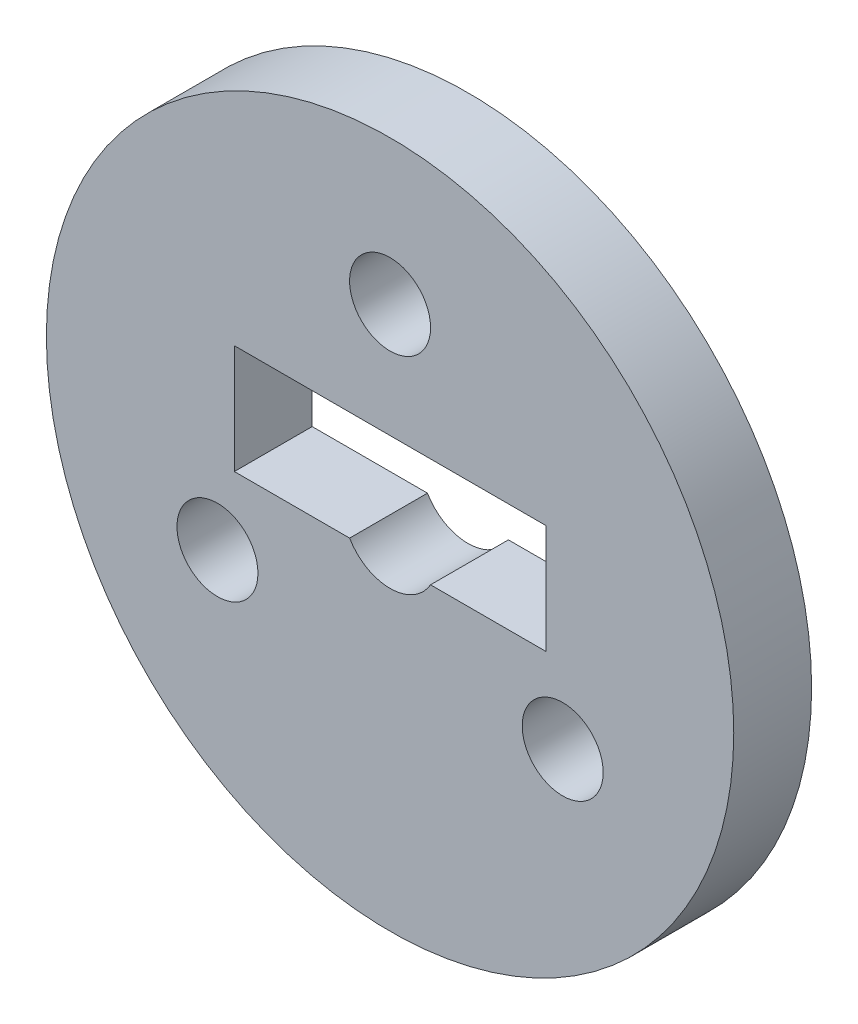
ISO-10303-21;
HEADER;
FILE_DESCRIPTION(('STEP AP214'),'2;1');
FILE_NAME('part.step','',(''),(''),'','','');
FILE_SCHEMA(('AUTOMOTIVE_DESIGN { 1 0 10303 214 1 1 1 1 }'));
ENDSEC;
DATA;
#1=APPLICATION_CONTEXT('core data for automotive mechanical design processes');
#2=APPLICATION_PROTOCOL_DEFINITION('international standard','automotive_design',2000,#1);
#3=PRODUCT_CONTEXT('',#1,'mechanical');
#4=PRODUCT('Part','Part','',(#3));
#5=PRODUCT_RELATED_PRODUCT_CATEGORY('part','',(#4));
#6=PRODUCT_DEFINITION_FORMATION('','',#4);
#7=PRODUCT_DEFINITION_CONTEXT('part definition',#1,'design');
#8=PRODUCT_DEFINITION('design','',#6,#7);
#9=PRODUCT_DEFINITION_SHAPE('','',#8);
#10=(LENGTH_UNIT() NAMED_UNIT(*) SI_UNIT(.MILLI.,.METRE.));
#11=(NAMED_UNIT(*) PLANE_ANGLE_UNIT() SI_UNIT($,.RADIAN.));
#12=(NAMED_UNIT(*) SI_UNIT($,.STERADIAN.) SOLID_ANGLE_UNIT());
#13=UNCERTAINTY_MEASURE_WITH_UNIT(LENGTH_MEASURE(1.E-05),#10,'distance_accuracy_value','');
#14=(GEOMETRIC_REPRESENTATION_CONTEXT(3) GLOBAL_UNCERTAINTY_ASSIGNED_CONTEXT((#13)) GLOBAL_UNIT_ASSIGNED_CONTEXT((#10,
#11,#12)) REPRESENTATION_CONTEXT('',''));
#15=CARTESIAN_POINT('',(0.,0.,0.));
#16=DIRECTION('',(0.,0.,1.));
#17=DIRECTION('',(1.,0.,0.));
#18=AXIS2_PLACEMENT_3D('',#15,#16,#17);
#19=CARTESIAN_POINT('',(0.,0.,5.));
#20=DIRECTION('',(0.,0.,-1.));
#21=DIRECTION('',(-1.,0.,0.));
#22=AXIS2_PLACEMENT_3D('',#19,#20,#21);
#23=CYLINDRICAL_SURFACE('',#22,3.);
#24=CARTESIAN_POINT('',(0.,0.,0.));
#25=DIRECTION('',(0.,0.,1.));
#26=DIRECTION('',(1.,0.,0.));
#27=AXIS2_PLACEMENT_3D('',#24,#25,#26);
#28=CIRCLE('',#27,3.);
#29=CARTESIAN_POINT('',(-2.59807621135332,-1.5,0.));
#30=VERTEX_POINT('',#29);
#31=CARTESIAN_POINT('',(2.59807621135332,-1.5,0.));
#32=VERTEX_POINT('',#31);
#33=EDGE_CURVE('E131',#30,#32,#28,.T.);
#34=ORIENTED_EDGE('',*,*,#33,.F.);
#35=DIRECTION('',(0.,0.,-1.));
#36=VECTOR('',#35,1.);
#37=CARTESIAN_POINT('',(-2.59807621135332,-1.5,5.));
#38=LINE('',#37,#36);
#39=CARTESIAN_POINT('',(-2.59807621135332,-1.5,5.));
#40=VERTEX_POINT('',#39);
#41=EDGE_CURVE('E11',#40,#30,#38,.T.);
#42=ORIENTED_EDGE('',*,*,#41,.F.);
#43=CARTESIAN_POINT('',(0.,0.,5.));
#44=DIRECTION('',(0.,0.,1.));
#45=DIRECTION('',(1.,0.,0.));
#46=AXIS2_PLACEMENT_3D('',#43,#44,#45);
#47=CIRCLE('',#46,3.);
#48=CARTESIAN_POINT('',(2.59807621135332,-1.5,5.));
#49=VERTEX_POINT('',#48);
#50=EDGE_CURVE('E155',#40,#49,#47,.T.);
#51=ORIENTED_EDGE('',*,*,#50,.T.);
#52=DIRECTION('',(0.,0.,-1.));
#53=VECTOR('',#52,1.);
#54=CARTESIAN_POINT('',(2.59807621135332,-1.5,5.));
#55=LINE('',#54,#53);
#56=EDGE_CURVE('E81',#49,#32,#55,.T.);
#57=ORIENTED_EDGE('',*,*,#56,.T.);
#58=EDGE_LOOP('',(#34,#42,#51,#57));
#59=FACE_BOUND('',#58,.T.);
#60=ADVANCED_FACE('F37',(#59),#23,.F.);
#61=CARTESIAN_POINT('',(0.,-1.5,5.));
#62=DIRECTION('',(0.,-1.,0.));
#63=DIRECTION('',(1.,0.,0.));
#64=AXIS2_PLACEMENT_3D('',#61,#62,#63);
#65=PLANE('',#64);
#66=DIRECTION('',(-1.,0.,0.));
#67=VECTOR('',#66,1.);
#68=CARTESIAN_POINT('',(0.,-1.5,0.));
#69=LINE('',#68,#67);
#70=CARTESIAN_POINT('',(-10.,-1.5,0.));
#71=VERTEX_POINT('',#70);
#72=EDGE_CURVE('E134',#30,#71,#69,.T.);
#73=ORIENTED_EDGE('',*,*,#72,.T.);
#74=DIRECTION('',(0.,0.,-1.));
#75=VECTOR('',#74,1.);
#76=CARTESIAN_POINT('',(-10.,-1.5,5.));
#77=LINE('',#76,#75);
#78=CARTESIAN_POINT('',(-10.,-1.5,5.));
#79=VERTEX_POINT('',#78);
#80=EDGE_CURVE('E45',#79,#71,#77,.T.);
#81=ORIENTED_EDGE('',*,*,#80,.F.);
#82=DIRECTION('',(-1.,0.,0.));
#83=VECTOR('',#82,1.);
#84=CARTESIAN_POINT('',(0.,-1.5,5.));
#85=LINE('',#84,#83);
#86=EDGE_CURVE('E115',#40,#79,#85,.T.);
#87=ORIENTED_EDGE('',*,*,#86,.F.);
#88=ORIENTED_EDGE('',*,*,#41,.T.);
#89=EDGE_LOOP('',(#73,#81,#87,#88));
#90=FACE_BOUND('',#89,.T.);
#91=ADVANCED_FACE('F164',(#90),#65,.F.);
#92=CARTESIAN_POINT('',(-10.,0.,5.));
#93=DIRECTION('',(1.,0.,0.));
#94=DIRECTION('',(0.,0.,-1.));
#95=AXIS2_PLACEMENT_3D('',#92,#93,#94);
#96=PLANE('',#95);
#97=DIRECTION('',(0.,-1.,0.));
#98=VECTOR('',#97,1.);
#99=CARTESIAN_POINT('',(-10.,0.,0.));
#100=LINE('',#99,#98);
#101=CARTESIAN_POINT('',(-10.,5.5,0.));
#102=VERTEX_POINT('',#101);
#103=EDGE_CURVE('E137',#102,#71,#100,.T.);
#104=ORIENTED_EDGE('',*,*,#103,.F.);
#105=DIRECTION('',(0.,0.,-1.));
#106=VECTOR('',#105,1.);
#107=CARTESIAN_POINT('',(-10.,5.5,5.));
#108=LINE('',#107,#106);
#109=CARTESIAN_POINT('',(-10.,5.5,5.));
#110=VERTEX_POINT('',#109);
#111=EDGE_CURVE('E103',#110,#102,#108,.T.);
#112=ORIENTED_EDGE('',*,*,#111,.F.);
#113=DIRECTION('',(0.,-1.,0.));
#114=VECTOR('',#113,1.);
#115=CARTESIAN_POINT('',(-10.,0.,5.));
#116=LINE('',#115,#114);
#117=EDGE_CURVE('E113',#110,#79,#116,.T.);
#118=ORIENTED_EDGE('',*,*,#117,.T.);
#119=ORIENTED_EDGE('',*,*,#80,.T.);
#120=EDGE_LOOP('',(#104,#112,#118,#119));
#121=FACE_BOUND('',#120,.T.);
#122=ADVANCED_FACE('F161',(#121),#96,.T.);
#123=CARTESIAN_POINT('',(0.,5.5,5.));
#124=DIRECTION('',(0.,-1.,0.));
#125=DIRECTION('',(1.,0.,0.));
#126=AXIS2_PLACEMENT_3D('',#123,#124,#125);
#127=PLANE('',#126);
#128=DIRECTION('',(-1.,0.,0.));
#129=VECTOR('',#128,1.);
#130=CARTESIAN_POINT('',(0.,5.5,0.));
#131=LINE('',#130,#129);
#132=CARTESIAN_POINT('',(9.99999999999999,5.5,0.));
#133=VERTEX_POINT('',#132);
#134=EDGE_CURVE('E102',#133,#102,#131,.T.);
#135=ORIENTED_EDGE('',*,*,#134,.F.);
#136=DIRECTION('',(0.,0.,-1.));
#137=VECTOR('',#136,1.);
#138=CARTESIAN_POINT('',(9.99999999999999,5.5,5.));
#139=LINE('',#138,#137);
#140=CARTESIAN_POINT('',(9.99999999999999,5.5,5.));
#141=VERTEX_POINT('',#140);
#142=EDGE_CURVE('E96',#141,#133,#139,.T.);
#143=ORIENTED_EDGE('',*,*,#142,.F.);
#144=DIRECTION('',(-1.,0.,0.));
#145=VECTOR('',#144,1.);
#146=CARTESIAN_POINT('',(0.,5.5,5.));
#147=LINE('',#146,#145);
#148=EDGE_CURVE('E100',#141,#110,#147,.T.);
#149=ORIENTED_EDGE('',*,*,#148,.T.);
#150=ORIENTED_EDGE('',*,*,#111,.T.);
#151=EDGE_LOOP('',(#135,#143,#149,#150));
#152=FACE_BOUND('',#151,.T.);
#153=ADVANCED_FACE('F98',(#152),#127,.T.);
#154=CARTESIAN_POINT('',(9.99999999999999,0.,5.));
#155=DIRECTION('',(1.,0.,0.));
#156=DIRECTION('',(0.,1.,0.));
#157=AXIS2_PLACEMENT_3D('',#154,#155,#156);
#158=PLANE('',#157);
#159=DIRECTION('',(0.,-1.,0.));
#160=VECTOR('',#159,1.);
#161=CARTESIAN_POINT('',(9.99999999999999,0.,0.));
#162=LINE('',#161,#160);
#163=CARTESIAN_POINT('',(9.99999999999999,-1.5,0.));
#164=VERTEX_POINT('',#163);
#165=EDGE_CURVE('E74',#133,#164,#162,.T.);
#166=ORIENTED_EDGE('',*,*,#165,.T.);
#167=DIRECTION('',(0.,0.,-1.));
#168=VECTOR('',#167,1.);
#169=CARTESIAN_POINT('',(9.99999999999999,-1.5,5.));
#170=LINE('',#169,#168);
#171=CARTESIAN_POINT('',(9.99999999999999,-1.5,5.));
#172=VERTEX_POINT('',#171);
#173=EDGE_CURVE('E104',#172,#164,#170,.T.);
#174=ORIENTED_EDGE('',*,*,#173,.F.);
#175=DIRECTION('',(0.,-1.,0.));
#176=VECTOR('',#175,1.);
#177=CARTESIAN_POINT('',(9.99999999999999,0.,5.));
#178=LINE('',#177,#176);
#179=EDGE_CURVE('E106',#141,#172,#178,.T.);
#180=ORIENTED_EDGE('',*,*,#179,.F.);
#181=ORIENTED_EDGE('',*,*,#142,.T.);
#182=EDGE_LOOP('',(#166,#174,#180,#181));
#183=FACE_BOUND('',#182,.T.);
#184=ADVANCED_FACE('F107',(#183),#158,.F.);
#185=CARTESIAN_POINT('',(0.,12.8,5.));
#186=DIRECTION('',(0.,0.,-1.));
#187=DIRECTION('',(-1.,0.,0.));
#188=AXIS2_PLACEMENT_3D('',#185,#186,#187);
#189=CYLINDRICAL_SURFACE('',#188,2.6);
#190=CARTESIAN_POINT('',(0.,12.8,5.));
#191=DIRECTION('',(0.,0.,1.));
#192=DIRECTION('',(1.,0.,0.));
#193=AXIS2_PLACEMENT_3D('',#190,#191,#192);
#194=CIRCLE('',#193,2.6);
#195=CARTESIAN_POINT('',(2.6,12.8,5.));
#196=VERTEX_POINT('',#195);
#197=EDGE_CURVE('E125',#196,#196,#194,.T.);
#198=ORIENTED_EDGE('',*,*,#197,.T.);
#199=EDGE_LOOP('',(#198));
#200=FACE_BOUND('',#199,.T.);
#201=CARTESIAN_POINT('',(0.,12.8,0.));
#202=DIRECTION('',(0.,0.,1.));
#203=DIRECTION('',(1.,0.,0.));
#204=AXIS2_PLACEMENT_3D('',#201,#202,#203);
#205=CIRCLE('',#204,2.6);
#206=CARTESIAN_POINT('',(2.6,12.8,0.));
#207=VERTEX_POINT('',#206);
#208=EDGE_CURVE('E149',#207,#207,#205,.T.);
#209=ORIENTED_EDGE('',*,*,#208,.F.);
#210=EDGE_LOOP('',(#209));
#211=FACE_BOUND('',#210,.T.);
#212=ADVANCED_FACE('F196',(#200,#211),#189,.F.);
#213=CARTESIAN_POINT('',(11.0851251684408,-6.4,5.));
#214=DIRECTION('',(0.,0.,-1.));
#215=DIRECTION('',(-1.,0.,0.));
#216=AXIS2_PLACEMENT_3D('',#213,#214,#215);
#217=CYLINDRICAL_SURFACE('',#216,2.6);
#218=CARTESIAN_POINT('',(11.0851251684408,-6.4,5.));
#219=DIRECTION('',(0.,0.,1.));
#220=DIRECTION('',(1.,0.,0.));
#221=AXIS2_PLACEMENT_3D('',#218,#219,#220);
#222=CIRCLE('',#221,2.6);
#223=CARTESIAN_POINT('',(13.6851251684408,-6.4,5.));
#224=VERTEX_POINT('',#223);
#225=EDGE_CURVE('E122',#224,#224,#222,.T.);
#226=ORIENTED_EDGE('',*,*,#225,.T.);
#227=EDGE_LOOP('',(#226));
#228=FACE_BOUND('',#227,.T.);
#229=CARTESIAN_POINT('',(11.0851251684408,-6.4,0.));
#230=DIRECTION('',(0.,0.,1.));
#231=DIRECTION('',(1.,0.,0.));
#232=AXIS2_PLACEMENT_3D('',#229,#230,#231);
#233=CIRCLE('',#232,2.6);
#234=CARTESIAN_POINT('',(13.6851251684408,-6.4,0.));
#235=VERTEX_POINT('',#234);
#236=EDGE_CURVE('E146',#235,#235,#233,.T.);
#237=ORIENTED_EDGE('',*,*,#236,.F.);
#238=EDGE_LOOP('',(#237));
#239=FACE_BOUND('',#238,.T.);
#240=ADVANCED_FACE('F191',(#228,#239),#217,.F.);
#241=CARTESIAN_POINT('',(-11.0851251684408,-6.40000000000001,5.));
#242=DIRECTION('',(0.,0.,-1.));
#243=DIRECTION('',(-1.,0.,0.));
#244=AXIS2_PLACEMENT_3D('',#241,#242,#243);
#245=CYLINDRICAL_SURFACE('',#244,2.6);
#246=CARTESIAN_POINT('',(-11.0851251684408,-6.40000000000001,5.));
#247=DIRECTION('',(0.,0.,1.));
#248=DIRECTION('',(1.,0.,0.));
#249=AXIS2_PLACEMENT_3D('',#246,#247,#248);
#250=CIRCLE('',#249,2.6);
#251=CARTESIAN_POINT('',(-8.48512516844081,-6.40000000000001,5.));
#252=VERTEX_POINT('',#251);
#253=EDGE_CURVE('E119',#252,#252,#250,.T.);
#254=ORIENTED_EDGE('',*,*,#253,.T.);
#255=EDGE_LOOP('',(#254));
#256=FACE_BOUND('',#255,.T.);
#257=CARTESIAN_POINT('',(-11.0851251684408,-6.40000000000001,0.));
#258=DIRECTION('',(0.,0.,1.));
#259=DIRECTION('',(1.,0.,0.));
#260=AXIS2_PLACEMENT_3D('',#257,#258,#259);
#261=CIRCLE('',#260,2.6);
#262=CARTESIAN_POINT('',(-8.48512516844081,-6.40000000000001,0.));
#263=VERTEX_POINT('',#262);
#264=EDGE_CURVE('E143',#263,#263,#261,.T.);
#265=ORIENTED_EDGE('',*,*,#264,.F.);
#266=EDGE_LOOP('',(#265));
#267=FACE_BOUND('',#266,.T.);
#268=ADVANCED_FACE('F184',(#256,#267),#245,.F.);
#269=EDGE_CURVE('E138',#164,#32,#69,.T.);
#270=ORIENTED_EDGE('',*,*,#269,.T.);
#271=ORIENTED_EDGE('',*,*,#56,.F.);
#272=EDGE_CURVE('E53',#172,#49,#85,.T.);
#273=ORIENTED_EDGE('',*,*,#272,.F.);
#274=ORIENTED_EDGE('',*,*,#173,.T.);
#275=EDGE_LOOP('',(#270,#271,#273,#274));
#276=FACE_BOUND('',#275,.T.);
#277=ADVANCED_FACE('F170',(#276),#65,.F.);
#278=CARTESIAN_POINT('',(0.,0.,5.));
#279=DIRECTION('',(0.,0.,-1.));
#280=DIRECTION('',(-1.,0.,0.));
#281=AXIS2_PLACEMENT_3D('',#278,#279,#280);
#282=CYLINDRICAL_SURFACE('',#281,22.0716390642382);
#283=CARTESIAN_POINT('',(0.,0.,5.));
#284=DIRECTION('',(0.,0.,1.));
#285=DIRECTION('',(1.,0.,0.));
#286=AXIS2_PLACEMENT_3D('',#283,#284,#285);
#287=CIRCLE('',#286,22.0716390642382);
#288=CARTESIAN_POINT('',(22.0716390642382,0.,5.));
#289=VERTEX_POINT('',#288);
#290=EDGE_CURVE('E128',#289,#289,#287,.T.);
#291=ORIENTED_EDGE('',*,*,#290,.F.);
#292=EDGE_LOOP('',(#291));
#293=FACE_BOUND('',#292,.T.);
#294=CARTESIAN_POINT('',(0.,0.,0.));
#295=DIRECTION('',(0.,0.,1.));
#296=DIRECTION('',(1.,0.,0.));
#297=AXIS2_PLACEMENT_3D('',#294,#295,#296);
#298=CIRCLE('',#297,22.0716390642382);
#299=CARTESIAN_POINT('',(22.0716390642382,0.,0.));
#300=VERTEX_POINT('',#299);
#301=EDGE_CURVE('E152',#300,#300,#298,.T.);
#302=ORIENTED_EDGE('',*,*,#301,.T.);
#303=EDGE_LOOP('',(#302));
#304=FACE_BOUND('',#303,.T.);
#305=ADVANCED_FACE('F183',(#293,#304),#282,.T.);
#306=CARTESIAN_POINT('',(0.,0.,5.));
#307=DIRECTION('',(0.,0.,1.));
#308=DIRECTION('',(1.,0.,0.));
#309=AXIS2_PLACEMENT_3D('',#306,#307,#308);
#310=PLANE('',#309);
#311=ORIENTED_EDGE('',*,*,#50,.F.);
#312=ORIENTED_EDGE('',*,*,#86,.T.);
#313=ORIENTED_EDGE('',*,*,#117,.F.);
#314=ORIENTED_EDGE('',*,*,#148,.F.);
#315=ORIENTED_EDGE('',*,*,#179,.T.);
#316=ORIENTED_EDGE('',*,*,#272,.T.);
#317=EDGE_LOOP('',(#311,#312,#313,#314,#315,#316));
#318=FACE_BOUND('',#317,.T.);
#319=ORIENTED_EDGE('',*,*,#253,.F.);
#320=EDGE_LOOP('',(#319));
#321=FACE_BOUND('',#320,.T.);
#322=ORIENTED_EDGE('',*,*,#225,.F.);
#323=EDGE_LOOP('',(#322));
#324=FACE_BOUND('',#323,.T.);
#325=ORIENTED_EDGE('',*,*,#197,.F.);
#326=EDGE_LOOP('',(#325));
#327=FACE_BOUND('',#326,.T.);
#328=ORIENTED_EDGE('',*,*,#290,.T.);
#329=EDGE_LOOP('',(#328));
#330=FACE_BOUND('',#329,.T.);
#331=ADVANCED_FACE('F110',(#318,#321,#324,#327,#330),#310,.T.);
#332=CARTESIAN_POINT('',(0.,0.,0.));
#333=DIRECTION('',(0.,0.,1.));
#334=DIRECTION('',(1.,0.,0.));
#335=AXIS2_PLACEMENT_3D('',#332,#333,#334);
#336=PLANE('',#335);
#337=ORIENTED_EDGE('',*,*,#33,.T.);
#338=ORIENTED_EDGE('',*,*,#269,.F.);
#339=ORIENTED_EDGE('',*,*,#165,.F.);
#340=ORIENTED_EDGE('',*,*,#134,.T.);
#341=ORIENTED_EDGE('',*,*,#103,.T.);
#342=ORIENTED_EDGE('',*,*,#72,.F.);
#343=EDGE_LOOP('',(#337,#338,#339,#340,#341,#342));
#344=FACE_BOUND('',#343,.T.);
#345=ORIENTED_EDGE('',*,*,#264,.T.);
#346=EDGE_LOOP('',(#345));
#347=FACE_BOUND('',#346,.T.);
#348=ORIENTED_EDGE('',*,*,#236,.T.);
#349=EDGE_LOOP('',(#348));
#350=FACE_BOUND('',#349,.T.);
#351=ORIENTED_EDGE('',*,*,#208,.T.);
#352=EDGE_LOOP('',(#351));
#353=FACE_BOUND('',#352,.T.);
#354=ORIENTED_EDGE('',*,*,#301,.F.);
#355=EDGE_LOOP('',(#354));
#356=FACE_BOUND('',#355,.T.);
#357=ADVANCED_FACE('F166',(#344,#347,#350,#353,#356),#336,.F.);
#358=CLOSED_SHELL('',(#60,#91,#122,#153,#184,#212,#240,#268,#277,#305,#331,#357));
#359=MANIFOLD_SOLID_BREP('B2',#358);
#360=ADVANCED_BREP_SHAPE_REPRESENTATION('',(#18,#359),#14);
#361=SHAPE_DEFINITION_REPRESENTATION(#9,#360);
ENDSEC;
END-ISO-10303-21;
